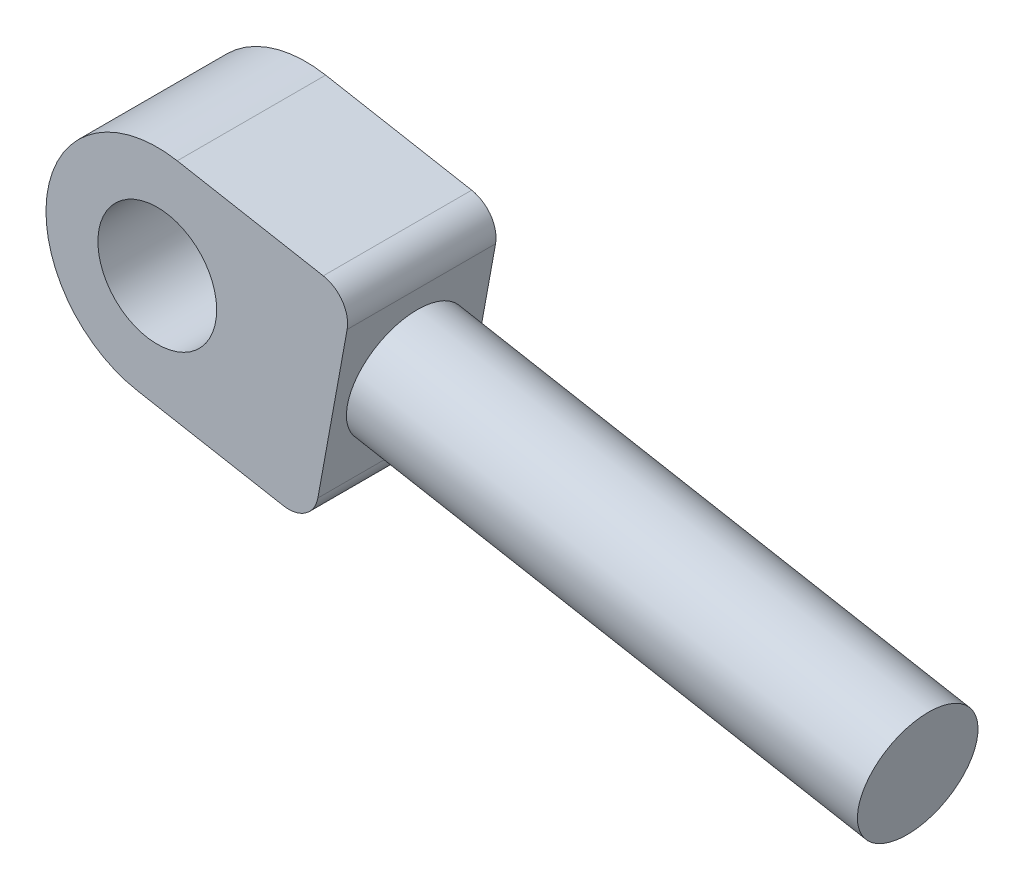
ISO-10303-21;
HEADER;
FILE_DESCRIPTION(('STEP AP214'),'2;1');
FILE_NAME('part.step','',(''),(''),'','','');
FILE_SCHEMA(('AUTOMOTIVE_DESIGN { 1 0 10303 214 1 1 1 1 }'));
ENDSEC;
DATA;
#1=APPLICATION_CONTEXT('core data for automotive mechanical design processes');
#2=APPLICATION_PROTOCOL_DEFINITION('international standard','automotive_design',2000,#1);
#3=PRODUCT_CONTEXT('',#1,'mechanical');
#4=PRODUCT('Part','Part','',(#3));
#5=PRODUCT_RELATED_PRODUCT_CATEGORY('part','',(#4));
#6=PRODUCT_DEFINITION_FORMATION('','',#4);
#7=PRODUCT_DEFINITION_CONTEXT('part definition',#1,'design');
#8=PRODUCT_DEFINITION('design','',#6,#7);
#9=PRODUCT_DEFINITION_SHAPE('','',#8);
#10=(LENGTH_UNIT() NAMED_UNIT(*) SI_UNIT(.MILLI.,.METRE.));
#11=(NAMED_UNIT(*) PLANE_ANGLE_UNIT() SI_UNIT($,.RADIAN.));
#12=(NAMED_UNIT(*) SI_UNIT($,.STERADIAN.) SOLID_ANGLE_UNIT());
#13=UNCERTAINTY_MEASURE_WITH_UNIT(LENGTH_MEASURE(1.E-05),#10,'distance_accuracy_value','');
#14=(GEOMETRIC_REPRESENTATION_CONTEXT(3) GLOBAL_UNCERTAINTY_ASSIGNED_CONTEXT((#13)) GLOBAL_UNIT_ASSIGNED_CONTEXT((#10,
#11,#12)) REPRESENTATION_CONTEXT('',''));
#15=CARTESIAN_POINT('',(0.,0.,0.));
#16=DIRECTION('',(0.,0.,1.));
#17=DIRECTION('',(1.,0.,0.));
#18=AXIS2_PLACEMENT_3D('',#15,#16,#17);
#19=CARTESIAN_POINT('',(123.720119702823,-12.5169820445766,5.));
#20=DIRECTION('',(0.,0.,1.));
#21=DIRECTION('',(1.,0.,0.));
#22=AXIS2_PLACEMENT_3D('',#19,#20,#21);
#23=PLANE('',#22);
#24=DIRECTION('',(0.179285955140522,0.983797004614951,0.));
#25=VECTOR('',#24,1.);
#26=CARTESIAN_POINT('',(136.870328421756,-7.28993597165071,5.));
#27=LINE('',#26,#25);
#28=CARTESIAN_POINT('',(134.539611004929,-20.0792970316451,5.));
#29=VERTEX_POINT('',#28);
#30=CARTESIAN_POINT('',(136.511756511475,-9.25752998088061,5.));
#31=VERTEX_POINT('',#30);
#32=EDGE_CURVE('E77',#29,#31,#27,.T.);
#33=ORIENTED_EDGE('',*,*,#32,.T.);
#34=CARTESIAN_POINT('',(134.544162502245,-8.89895807059957,5.));
#35=DIRECTION('',(0.,0.,1.));
#36=DIRECTION('',(1.,0.,0.));
#37=AXIS2_PLACEMENT_3D('',#34,#35,#36);
#38=CIRCLE('',#37,2.);
#39=CARTESIAN_POINT('',(134.902734412526,-6.93136406136967,5.));
#40=VERTEX_POINT('',#39);
#41=EDGE_CURVE('E25',#31,#40,#38,.T.);
#42=ORIENTED_EDGE('',*,*,#41,.T.);
#43=DIRECTION('',(-0.983797004614952,0.179285955140521,0.));
#44=VECTOR('',#43,1.);
#45=CARTESIAN_POINT('',(125.064764366377,-5.13850450996445,5.));
#46=LINE('',#45,#44);
#47=CARTESIAN_POINT('',(125.064764366377,-5.13850450996445,5.));
#48=VERTEX_POINT('',#47);
#49=EDGE_CURVE('E83',#40,#48,#46,.T.);
#50=ORIENTED_EDGE('',*,*,#49,.T.);
#51=CARTESIAN_POINT('',(123.720119702823,-12.5169820445766,5.));
#52=DIRECTION('',(0.,0.,1.));
#53=DIRECTION('',(1.,0.,0.));
#54=AXIS2_PLACEMENT_3D('',#51,#52,#53);
#55=CIRCLE('',#54,7.5);
#56=CARTESIAN_POINT('',(122.375475039269,-19.8954595791887,5.));
#57=VERTEX_POINT('',#56);
#58=EDGE_CURVE('E78',#48,#57,#55,.T.);
#59=ORIENTED_EDGE('',*,*,#58,.T.);
#60=DIRECTION('',(0.983797004614952,-0.179285955140521,0.));
#61=VECTOR('',#60,1.);
#62=CARTESIAN_POINT('',(134.181039094648,-22.046891040875,5.));
#63=LINE('',#62,#61);
#64=CARTESIAN_POINT('',(132.213445085418,-21.6883191305939,5.));
#65=VERTEX_POINT('',#64);
#66=EDGE_CURVE('E69',#57,#65,#63,.T.);
#67=ORIENTED_EDGE('',*,*,#66,.T.);
#68=CARTESIAN_POINT('',(132.572016995699,-19.7207251213641,5.));
#69=DIRECTION('',(0.,0.,1.));
#70=DIRECTION('',(1.,0.,0.));
#71=AXIS2_PLACEMENT_3D('',#68,#69,#70);
#72=CIRCLE('',#71,2.);
#73=EDGE_CURVE('E111',#65,#29,#72,.T.);
#74=ORIENTED_EDGE('',*,*,#73,.T.);
#75=EDGE_LOOP('',(#33,#42,#50,#59,#67,#74));
#76=FACE_BOUND('',#75,.T.);
#77=CARTESIAN_POINT('',(123.720119702823,-12.5169820445766,5.));
#78=DIRECTION('',(0.,0.,1.));
#79=DIRECTION('',(1.,0.,0.));
#80=AXIS2_PLACEMENT_3D('',#77,#78,#79);
#81=CIRCLE('',#80,4.);
#82=CARTESIAN_POINT('',(127.720119702823,-12.5169820445766,5.));
#83=VERTEX_POINT('',#82);
#84=EDGE_CURVE('E131',#83,#83,#81,.T.);
#85=ORIENTED_EDGE('',*,*,#84,.F.);
#86=EDGE_LOOP('',(#85));
#87=FACE_BOUND('',#86,.T.);
#88=ADVANCED_FACE('F17',(#76,#87),#23,.T.);
#89=CARTESIAN_POINT('',(123.720119702823,-12.5169820445766,-5.));
#90=DIRECTION('',(0.,0.,1.));
#91=DIRECTION('',(1.,0.,0.));
#92=AXIS2_PLACEMENT_3D('',#89,#90,#91);
#93=PLANE('',#92);
#94=DIRECTION('',(-0.983797004614952,0.179285955140521,0.));
#95=VECTOR('',#94,1.);
#96=CARTESIAN_POINT('',(125.064764366377,-5.13850450996445,-5.));
#97=LINE('',#96,#95);
#98=CARTESIAN_POINT('',(134.902734412526,-6.93136406136967,-5.));
#99=VERTEX_POINT('',#98);
#100=CARTESIAN_POINT('',(125.064764366377,-5.13850450996445,-5.));
#101=VERTEX_POINT('',#100);
#102=EDGE_CURVE('E87',#99,#101,#97,.T.);
#103=ORIENTED_EDGE('',*,*,#102,.F.);
#104=CARTESIAN_POINT('',(134.544162502245,-8.89895807059957,-5.));
#105=DIRECTION('',(0.,0.,1.));
#106=DIRECTION('',(1.,0.,0.));
#107=AXIS2_PLACEMENT_3D('',#104,#105,#106);
#108=CIRCLE('',#107,2.);
#109=CARTESIAN_POINT('',(136.511756511475,-9.25752998088061,-5.));
#110=VERTEX_POINT('',#109);
#111=EDGE_CURVE('E105',#99,#110,#108,.F.);
#112=ORIENTED_EDGE('',*,*,#111,.T.);
#113=DIRECTION('',(0.179285955140522,0.983797004614951,0.));
#114=VECTOR('',#113,1.);
#115=CARTESIAN_POINT('',(136.870328421756,-7.28993597165071,-5.));
#116=LINE('',#115,#114);
#117=CARTESIAN_POINT('',(134.539611004929,-20.0792970316451,-5.));
#118=VERTEX_POINT('',#117);
#119=EDGE_CURVE('E124',#118,#110,#116,.T.);
#120=ORIENTED_EDGE('',*,*,#119,.F.);
#121=CARTESIAN_POINT('',(132.572016995699,-19.7207251213641,-5.));
#122=DIRECTION('',(0.,0.,1.));
#123=DIRECTION('',(1.,0.,0.));
#124=AXIS2_PLACEMENT_3D('',#121,#122,#123);
#125=CIRCLE('',#124,2.);
#126=CARTESIAN_POINT('',(132.213445085418,-21.6883191305939,-5.));
#127=VERTEX_POINT('',#126);
#128=EDGE_CURVE('E103',#118,#127,#125,.F.);
#129=ORIENTED_EDGE('',*,*,#128,.T.);
#130=DIRECTION('',(0.983797004614952,-0.179285955140521,0.));
#131=VECTOR('',#130,1.);
#132=CARTESIAN_POINT('',(134.181039094648,-22.046891040875,-5.));
#133=LINE('',#132,#131);
#134=CARTESIAN_POINT('',(122.375475039269,-19.8954595791887,-5.));
#135=VERTEX_POINT('',#134);
#136=EDGE_CURVE('E127',#135,#127,#133,.T.);
#137=ORIENTED_EDGE('',*,*,#136,.F.);
#138=CARTESIAN_POINT('',(123.720119702823,-12.5169820445766,-5.));
#139=DIRECTION('',(0.,0.,1.));
#140=DIRECTION('',(1.,0.,0.));
#141=AXIS2_PLACEMENT_3D('',#138,#139,#140);
#142=CIRCLE('',#141,7.5);
#143=EDGE_CURVE('E91',#101,#135,#142,.T.);
#144=ORIENTED_EDGE('',*,*,#143,.F.);
#145=EDGE_LOOP('',(#103,#112,#120,#129,#137,#144));
#146=FACE_BOUND('',#145,.T.);
#147=CARTESIAN_POINT('',(123.720119702823,-12.5169820445766,-5.));
#148=DIRECTION('',(0.,0.,1.));
#149=DIRECTION('',(1.,0.,0.));
#150=AXIS2_PLACEMENT_3D('',#147,#148,#149);
#151=CIRCLE('',#150,4.);
#152=CARTESIAN_POINT('',(127.720119702823,-12.5169820445766,-5.));
#153=VERTEX_POINT('',#152);
#154=EDGE_CURVE('E134',#153,#153,#151,.T.);
#155=ORIENTED_EDGE('',*,*,#154,.T.);
#156=EDGE_LOOP('',(#155));
#157=FACE_BOUND('',#156,.T.);
#158=ADVANCED_FACE('F122',(#146,#157),#93,.F.);
#159=CARTESIAN_POINT('',(123.720119702823,-12.5169820445766,5.));
#160=DIRECTION('',(0.,0.,-1.));
#161=DIRECTION('',(-1.,0.,0.));
#162=AXIS2_PLACEMENT_3D('',#159,#160,#161);
#163=CYLINDRICAL_SURFACE('',#162,7.5);
#164=ORIENTED_EDGE('',*,*,#143,.T.);
#165=DIRECTION('',(0.,0.,-1.));
#166=VECTOR('',#165,1.);
#167=CARTESIAN_POINT('',(122.375475039269,-19.8954595791887,5.));
#168=LINE('',#167,#166);
#169=EDGE_CURVE('E73',#57,#135,#168,.T.);
#170=ORIENTED_EDGE('',*,*,#169,.F.);
#171=ORIENTED_EDGE('',*,*,#58,.F.);
#172=DIRECTION('',(0.,0.,-1.));
#173=VECTOR('',#172,1.);
#174=CARTESIAN_POINT('',(125.064764366377,-5.13850450996445,5.));
#175=LINE('',#174,#173);
#176=EDGE_CURVE('E93',#48,#101,#175,.T.);
#177=ORIENTED_EDGE('',*,*,#176,.T.);
#178=EDGE_LOOP('',(#164,#170,#171,#177));
#179=FACE_BOUND('',#178,.T.);
#180=ADVANCED_FACE('F89',(#179),#163,.T.);
#181=CARTESIAN_POINT('',(134.181039094648,-22.046891040875,5.));
#182=DIRECTION('',(0.179285955140521,0.983797004614952,0.));
#183=DIRECTION('',(-0.983797004614952,0.179285955140521,0.));
#184=AXIS2_PLACEMENT_3D('',#181,#182,#183);
#185=PLANE('',#184);
#186=ORIENTED_EDGE('',*,*,#136,.T.);
#187=DIRECTION('',(0.,0.,-1.));
#188=VECTOR('',#187,1.);
#189=CARTESIAN_POINT('',(132.213445085418,-21.6883191305939,5.));
#190=LINE('',#189,#188);
#191=EDGE_CURVE('E11',#127,#65,#190,.F.);
#192=ORIENTED_EDGE('',*,*,#191,.T.);
#193=ORIENTED_EDGE('',*,*,#66,.F.);
#194=ORIENTED_EDGE('',*,*,#169,.T.);
#195=EDGE_LOOP('',(#186,#192,#193,#194));
#196=FACE_BOUND('',#195,.T.);
#197=ADVANCED_FACE('F71',(#196),#185,.F.);
#198=CARTESIAN_POINT('',(136.870328421756,-7.28993597165071,5.));
#199=DIRECTION('',(-0.983797004614951,0.179285955140522,0.));
#200=DIRECTION('',(-0.179285955140522,-0.983797004614951,0.));
#201=AXIS2_PLACEMENT_3D('',#198,#199,#200);
#202=PLANE('',#201);
#203=CARTESIAN_POINT('',(135.525683758202,-14.6684135062628,0.));
#204=DIRECTION('',(0.983797004614952,-0.179285955140522,0.));
#205=DIRECTION('',(0.179285955140522,0.983797004614952,0.));
#206=AXIS2_PLACEMENT_3D('',#203,#204,#205);
#207=CIRCLE('',#206,4.);
#208=CARTESIAN_POINT('',(136.242827578764,-10.733225487803,0.));
#209=VERTEX_POINT('',#208);
#210=EDGE_CURVE('E92',#209,#209,#207,.T.);
#211=ORIENTED_EDGE('',*,*,#210,.F.);
#212=EDGE_LOOP('',(#211));
#213=FACE_BOUND('',#212,.T.);
#214=ORIENTED_EDGE('',*,*,#119,.T.);
#215=DIRECTION('',(0.,0.,-1.));
#216=VECTOR('',#215,1.);
#217=CARTESIAN_POINT('',(136.511756511475,-9.25752998088061,5.));
#218=LINE('',#217,#216);
#219=EDGE_CURVE('E38',#110,#31,#218,.F.);
#220=ORIENTED_EDGE('',*,*,#219,.T.);
#221=ORIENTED_EDGE('',*,*,#32,.F.);
#222=DIRECTION('',(0.,0.,-1.));
#223=VECTOR('',#222,1.);
#224=CARTESIAN_POINT('',(134.539611004929,-20.0792970316451,5.));
#225=LINE('',#224,#223);
#226=EDGE_CURVE('E107',#29,#118,#225,.T.);
#227=ORIENTED_EDGE('',*,*,#226,.T.);
#228=EDGE_LOOP('',(#214,#220,#221,#227));
#229=FACE_BOUND('',#228,.T.);
#230=ADVANCED_FACE('F125',(#213,#229),#202,.F.);
#231=CARTESIAN_POINT('',(125.064764366377,-5.13850450996445,5.));
#232=DIRECTION('',(-0.179285955140521,-0.983797004614952,0.));
#233=DIRECTION('',(0.983797004614952,-0.179285955140521,0.));
#234=AXIS2_PLACEMENT_3D('',#231,#232,#233);
#235=PLANE('',#234);
#236=ORIENTED_EDGE('',*,*,#49,.F.);
#237=DIRECTION('',(0.,0.,-1.));
#238=VECTOR('',#237,1.);
#239=CARTESIAN_POINT('',(134.902734412526,-6.93136406136967,5.));
#240=LINE('',#239,#238);
#241=EDGE_CURVE('E96',#40,#99,#240,.T.);
#242=ORIENTED_EDGE('',*,*,#241,.T.);
#243=ORIENTED_EDGE('',*,*,#102,.T.);
#244=ORIENTED_EDGE('',*,*,#176,.F.);
#245=EDGE_LOOP('',(#236,#242,#243,#244));
#246=FACE_BOUND('',#245,.T.);
#247=ADVANCED_FACE('F116',(#246),#235,.F.);
#248=CARTESIAN_POINT('',(123.720119702823,-12.5169820445766,5.));
#249=DIRECTION('',(0.,0.,-1.));
#250=DIRECTION('',(-1.,0.,0.));
#251=AXIS2_PLACEMENT_3D('',#248,#249,#250);
#252=CYLINDRICAL_SURFACE('',#251,4.);
#253=ORIENTED_EDGE('',*,*,#84,.T.);
#254=EDGE_LOOP('',(#253));
#255=FACE_BOUND('',#254,.T.);
#256=ORIENTED_EDGE('',*,*,#154,.F.);
#257=EDGE_LOOP('',(#256));
#258=FACE_BOUND('',#257,.T.);
#259=ADVANCED_FACE('F148',(#255,#258),#252,.F.);
#260=CARTESIAN_POINT('',(169.958578919725,-20.9434219361811,0.));
#261=DIRECTION('',(-0.983797004614952,0.179285955140522,0.));
#262=DIRECTION('',(-0.179285955140522,-0.983797004614952,0.));
#263=AXIS2_PLACEMENT_3D('',#260,#261,#262);
#264=CYLINDRICAL_SURFACE('',#263,4.);
#265=CARTESIAN_POINT('',(169.958578919725,-20.9434219361811,0.));
#266=DIRECTION('',(0.983797004614952,-0.179285955140522,0.));
#267=DIRECTION('',(0.179285955140522,0.983797004614952,0.));
#268=AXIS2_PLACEMENT_3D('',#265,#266,#267);
#269=CIRCLE('',#268,4.);
#270=CARTESIAN_POINT('',(170.675722740288,-17.0082339177213,0.));
#271=VERTEX_POINT('',#270);
#272=EDGE_CURVE('E137',#271,#271,#269,.T.);
#273=ORIENTED_EDGE('',*,*,#272,.F.);
#274=EDGE_LOOP('',(#273));
#275=FACE_BOUND('',#274,.T.);
#276=ORIENTED_EDGE('',*,*,#210,.T.);
#277=EDGE_LOOP('',(#276));
#278=FACE_BOUND('',#277,.T.);
#279=ADVANCED_FACE('F145',(#275,#278),#264,.T.);
#280=CARTESIAN_POINT('',(169.958578919725,-20.9434219361811,0.));
#281=DIRECTION('',(0.983797004614952,-0.179285955140522,0.));
#282=DIRECTION('',(0.179285955140522,0.983797004614952,0.));
#283=AXIS2_PLACEMENT_3D('',#280,#281,#282);
#284=PLANE('',#283);
#285=ORIENTED_EDGE('',*,*,#272,.T.);
#286=EDGE_LOOP('',(#285));
#287=FACE_BOUND('',#286,.T.);
#288=ADVANCED_FACE('F143',(#287),#284,.T.);
#289=CARTESIAN_POINT('',(134.544162502245,-8.89895807059957,5.));
#290=DIRECTION('',(0.,0.,-1.));
#291=DIRECTION('',(-1.,0.,0.));
#292=AXIS2_PLACEMENT_3D('',#289,#290,#291);
#293=CYLINDRICAL_SURFACE('',#292,2.);
#294=ORIENTED_EDGE('',*,*,#41,.F.);
#295=ORIENTED_EDGE('',*,*,#219,.F.);
#296=ORIENTED_EDGE('',*,*,#111,.F.);
#297=ORIENTED_EDGE('',*,*,#241,.F.);
#298=EDGE_LOOP('',(#294,#295,#296,#297));
#299=FACE_BOUND('',#298,.T.);
#300=ADVANCED_FACE('F119',(#299),#293,.T.);
#301=CARTESIAN_POINT('',(132.572016995699,-19.7207251213641,5.));
#302=DIRECTION('',(0.,0.,-1.));
#303=DIRECTION('',(-1.,0.,0.));
#304=AXIS2_PLACEMENT_3D('',#301,#302,#303);
#305=CYLINDRICAL_SURFACE('',#304,2.);
#306=ORIENTED_EDGE('',*,*,#73,.F.);
#307=ORIENTED_EDGE('',*,*,#191,.F.);
#308=ORIENTED_EDGE('',*,*,#128,.F.);
#309=ORIENTED_EDGE('',*,*,#226,.F.);
#310=EDGE_LOOP('',(#306,#307,#308,#309));
#311=FACE_BOUND('',#310,.T.);
#312=ADVANCED_FACE('F19',(#311),#305,.T.);
#313=CLOSED_SHELL('',(#88,#158,#180,#197,#230,#247,#259,#279,#288,#300,#312));
#314=MANIFOLD_SOLID_BREP('B1',#313);
#315=ADVANCED_BREP_SHAPE_REPRESENTATION('',(#18,#314),#14);
#316=SHAPE_DEFINITION_REPRESENTATION(#9,#315);
ENDSEC;
END-ISO-10303-21;
